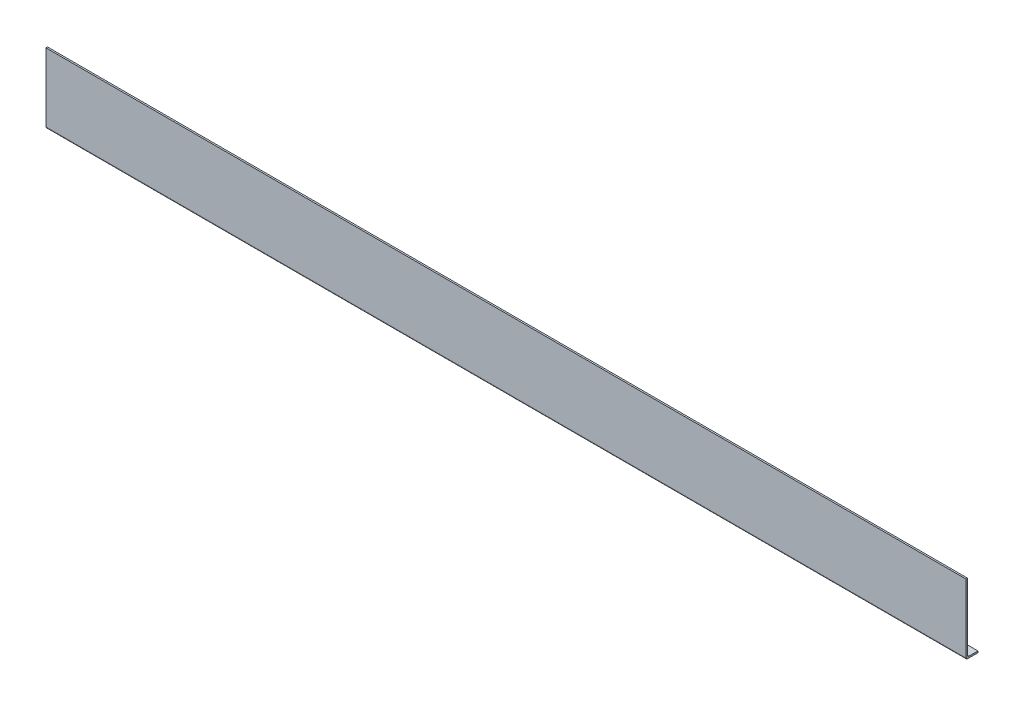
ISO-10303-21;
HEADER;
FILE_DESCRIPTION(('STEP AP214'),'2;1');
FILE_NAME('part.step','',(''),(''),'','','');
FILE_SCHEMA(('AUTOMOTIVE_DESIGN { 1 0 10303 214 1 1 1 1 }'));
ENDSEC;
DATA;
#1=APPLICATION_CONTEXT('core data for automotive mechanical design processes');
#2=APPLICATION_PROTOCOL_DEFINITION('international standard','automotive_design',2000,#1);
#3=PRODUCT_CONTEXT('',#1,'mechanical');
#4=PRODUCT('Part','Part','',(#3));
#5=PRODUCT_RELATED_PRODUCT_CATEGORY('part','',(#4));
#6=PRODUCT_DEFINITION_FORMATION('','',#4);
#7=PRODUCT_DEFINITION_CONTEXT('part definition',#1,'design');
#8=PRODUCT_DEFINITION('design','',#6,#7);
#9=PRODUCT_DEFINITION_SHAPE('','',#8);
#10=(LENGTH_UNIT() NAMED_UNIT(*) SI_UNIT(.MILLI.,.METRE.));
#11=(NAMED_UNIT(*) PLANE_ANGLE_UNIT() SI_UNIT($,.RADIAN.));
#12=(NAMED_UNIT(*) SI_UNIT($,.STERADIAN.) SOLID_ANGLE_UNIT());
#13=UNCERTAINTY_MEASURE_WITH_UNIT(LENGTH_MEASURE(1.E-05),#10,'distance_accuracy_value','');
#14=(GEOMETRIC_REPRESENTATION_CONTEXT(3) GLOBAL_UNCERTAINTY_ASSIGNED_CONTEXT((#13)) GLOBAL_UNIT_ASSIGNED_CONTEXT((#10,
#11,#12)) REPRESENTATION_CONTEXT('',''));
#15=CARTESIAN_POINT('',(0.,0.,0.));
#16=DIRECTION('',(0.,0.,1.));
#17=DIRECTION('',(1.,0.,0.));
#18=AXIS2_PLACEMENT_3D('',#15,#16,#17);
#19=CARTESIAN_POINT('',(1750.,3.,0.));
#20=DIRECTION('',(0.,0.,1.));
#21=DIRECTION('',(1.,0.,0.));
#22=AXIS2_PLACEMENT_3D('',#19,#20,#21);
#23=PLANE('',#22);
#24=DIRECTION('',(0.,1.,0.));
#25=VECTOR('',#24,1.);
#26=CARTESIAN_POINT('',(0.,3.,0.));
#27=LINE('',#26,#25);
#28=CARTESIAN_POINT('',(0.,0.,0.));
#29=VERTEX_POINT('',#28);
#30=CARTESIAN_POINT('',(0.,3.,0.));
#31=VERTEX_POINT('',#30);
#32=EDGE_CURVE('E123',#29,#31,#27,.T.);
#33=ORIENTED_EDGE('',*,*,#32,.T.);
#34=DIRECTION('',(-1.,0.,0.));
#35=VECTOR('',#34,1.);
#36=CARTESIAN_POINT('',(1750.,3.,0.));
#37=LINE('',#36,#35);
#38=CARTESIAN_POINT('',(1750.,3.,0.));
#39=VERTEX_POINT('',#38);
#40=EDGE_CURVE('E104',#39,#31,#37,.T.);
#41=ORIENTED_EDGE('',*,*,#40,.F.);
#42=DIRECTION('',(0.,1.,0.));
#43=VECTOR('',#42,1.);
#44=CARTESIAN_POINT('',(1750.,3.,0.));
#45=LINE('',#44,#43);
#46=CARTESIAN_POINT('',(1750.,0.,0.));
#47=VERTEX_POINT('',#46);
#48=EDGE_CURVE('E111',#47,#39,#45,.T.);
#49=ORIENTED_EDGE('',*,*,#48,.F.);
#50=DIRECTION('',(-1.,0.,0.));
#51=VECTOR('',#50,1.);
#52=CARTESIAN_POINT('',(1750.,0.,0.));
#53=LINE('',#52,#51);
#54=EDGE_CURVE('E162',#47,#29,#53,.T.);
#55=ORIENTED_EDGE('',*,*,#54,.T.);
#56=EDGE_LOOP('',(#33,#41,#49,#55));
#57=FACE_BOUND('',#56,.T.);
#58=ADVANCED_FACE('F33',(#57),#23,.F.);
#59=CARTESIAN_POINT('',(1750.,3.,0.));
#60=DIRECTION('',(0.,-1.,0.));
#61=DIRECTION('',(0.,0.,-1.));
#62=AXIS2_PLACEMENT_3D('',#59,#60,#61);
#63=PLANE('',#62);
#64=DIRECTION('',(0.,0.,1.));
#65=VECTOR('',#64,1.);
#66=CARTESIAN_POINT('',(0.,3.,0.));
#67=LINE('',#66,#65);
#68=CARTESIAN_POINT('',(0.,3.,17.));
#69=VERTEX_POINT('',#68);
#70=EDGE_CURVE('E143',#31,#69,#67,.T.);
#71=ORIENTED_EDGE('',*,*,#70,.T.);
#72=DIRECTION('',(-1.,0.,0.));
#73=VECTOR('',#72,1.);
#74=CARTESIAN_POINT('',(1750.,3.,17.));
#75=LINE('',#74,#73);
#76=CARTESIAN_POINT('',(1750.,3.,17.));
#77=VERTEX_POINT('',#76);
#78=EDGE_CURVE('E107',#69,#77,#75,.F.);
#79=ORIENTED_EDGE('',*,*,#78,.T.);
#80=DIRECTION('',(0.,0.,1.));
#81=VECTOR('',#80,1.);
#82=CARTESIAN_POINT('',(1750.,3.,0.));
#83=LINE('',#82,#81);
#84=EDGE_CURVE('E99',#39,#77,#83,.T.);
#85=ORIENTED_EDGE('',*,*,#84,.F.);
#86=ORIENTED_EDGE('',*,*,#40,.T.);
#87=EDGE_LOOP('',(#71,#79,#85,#86));
#88=FACE_BOUND('',#87,.T.);
#89=ADVANCED_FACE('F102',(#88),#63,.F.);
#90=CARTESIAN_POINT('',(1750.,3.,20.));
#91=DIRECTION('',(0.,0.,1.));
#92=DIRECTION('',(1.,0.,0.));
#93=AXIS2_PLACEMENT_3D('',#90,#91,#92);
#94=PLANE('',#93);
#95=DIRECTION('',(0.,1.,0.));
#96=VECTOR('',#95,1.);
#97=CARTESIAN_POINT('',(1750.,3.,20.));
#98=LINE('',#97,#96);
#99=CARTESIAN_POINT('',(1750.,6.,20.));
#100=VERTEX_POINT('',#99);
#101=CARTESIAN_POINT('',(1750.,133.,20.));
#102=VERTEX_POINT('',#101);
#103=EDGE_CURVE('E110',#100,#102,#98,.T.);
#104=ORIENTED_EDGE('',*,*,#103,.F.);
#105=DIRECTION('',(-1.,0.,0.));
#106=VECTOR('',#105,1.);
#107=CARTESIAN_POINT('',(0.,6.,20.));
#108=LINE('',#107,#106);
#109=CARTESIAN_POINT('',(0.,6.,20.));
#110=VERTEX_POINT('',#109);
#111=EDGE_CURVE('E124',#100,#110,#108,.T.);
#112=ORIENTED_EDGE('',*,*,#111,.T.);
#113=DIRECTION('',(0.,1.,0.));
#114=VECTOR('',#113,1.);
#115=CARTESIAN_POINT('',(0.,3.,20.));
#116=LINE('',#115,#114);
#117=CARTESIAN_POINT('',(0.,133.,20.));
#118=VERTEX_POINT('',#117);
#119=EDGE_CURVE('E145',#110,#118,#116,.T.);
#120=ORIENTED_EDGE('',*,*,#119,.T.);
#121=DIRECTION('',(-1.,0.,0.));
#122=VECTOR('',#121,1.);
#123=CARTESIAN_POINT('',(1750.,133.,20.));
#124=LINE('',#123,#122);
#125=EDGE_CURVE('E125',#102,#118,#124,.T.);
#126=ORIENTED_EDGE('',*,*,#125,.F.);
#127=EDGE_LOOP('',(#104,#112,#120,#126));
#128=FACE_BOUND('',#127,.T.);
#129=ADVANCED_FACE('F153',(#128),#94,.F.);
#130=CARTESIAN_POINT('',(1750.,133.,23.));
#131=DIRECTION('',(0.,-1.,0.));
#132=DIRECTION('',(0.,0.,-1.));
#133=AXIS2_PLACEMENT_3D('',#130,#131,#132);
#134=PLANE('',#133);
#135=DIRECTION('',(0.,0.,1.));
#136=VECTOR('',#135,1.);
#137=CARTESIAN_POINT('',(0.,133.,23.));
#138=LINE('',#137,#136);
#139=CARTESIAN_POINT('',(0.,133.,23.));
#140=VERTEX_POINT('',#139);
#141=EDGE_CURVE('E165',#118,#140,#138,.T.);
#142=ORIENTED_EDGE('',*,*,#141,.T.);
#143=DIRECTION('',(-1.,0.,0.));
#144=VECTOR('',#143,1.);
#145=CARTESIAN_POINT('',(1750.,133.,23.));
#146=LINE('',#145,#144);
#147=CARTESIAN_POINT('',(1750.,133.,23.));
#148=VERTEX_POINT('',#147);
#149=EDGE_CURVE('E130',#148,#140,#146,.T.);
#150=ORIENTED_EDGE('',*,*,#149,.F.);
#151=DIRECTION('',(0.,0.,1.));
#152=VECTOR('',#151,1.);
#153=CARTESIAN_POINT('',(1750.,133.,23.));
#154=LINE('',#153,#152);
#155=EDGE_CURVE('E155',#102,#148,#154,.T.);
#156=ORIENTED_EDGE('',*,*,#155,.F.);
#157=ORIENTED_EDGE('',*,*,#125,.T.);
#158=EDGE_LOOP('',(#142,#150,#156,#157));
#159=FACE_BOUND('',#158,.T.);
#160=ADVANCED_FACE('F174',(#159),#134,.F.);
#161=CARTESIAN_POINT('',(1750.,0.,23.));
#162=DIRECTION('',(0.,0.,-1.));
#163=DIRECTION('',(-1.,0.,0.));
#164=AXIS2_PLACEMENT_3D('',#161,#162,#163);
#165=PLANE('',#164);
#166=DIRECTION('',(0.,-1.,0.));
#167=VECTOR('',#166,1.);
#168=CARTESIAN_POINT('',(0.,0.,23.));
#169=LINE('',#168,#167);
#170=CARTESIAN_POINT('',(0.,3.,23.));
#171=VERTEX_POINT('',#170);
#172=EDGE_CURVE('E167',#140,#171,#169,.T.);
#173=ORIENTED_EDGE('',*,*,#172,.T.);
#174=DIRECTION('',(-1.,0.,0.));
#175=VECTOR('',#174,1.);
#176=CARTESIAN_POINT('',(1750.,3.,23.));
#177=LINE('',#176,#175);
#178=CARTESIAN_POINT('',(1750.,3.,23.));
#179=VERTEX_POINT('',#178);
#180=EDGE_CURVE('E48',#171,#179,#177,.F.);
#181=ORIENTED_EDGE('',*,*,#180,.T.);
#182=DIRECTION('',(0.,-1.,0.));
#183=VECTOR('',#182,1.);
#184=CARTESIAN_POINT('',(1750.,0.,23.));
#185=LINE('',#184,#183);
#186=EDGE_CURVE('E157',#148,#179,#185,.T.);
#187=ORIENTED_EDGE('',*,*,#186,.F.);
#188=ORIENTED_EDGE('',*,*,#149,.T.);
#189=EDGE_LOOP('',(#173,#181,#187,#188));
#190=FACE_BOUND('',#189,.T.);
#191=ADVANCED_FACE('F172',(#190),#165,.F.);
#192=CARTESIAN_POINT('',(1750.,0.,0.));
#193=DIRECTION('',(0.,1.,0.));
#194=DIRECTION('',(0.,0.,1.));
#195=AXIS2_PLACEMENT_3D('',#192,#193,#194);
#196=PLANE('',#195);
#197=DIRECTION('',(0.,0.,-1.));
#198=VECTOR('',#197,1.);
#199=CARTESIAN_POINT('',(1750.,0.,0.));
#200=LINE('',#199,#198);
#201=CARTESIAN_POINT('',(1750.,0.,20.));
#202=VERTEX_POINT('',#201);
#203=EDGE_CURVE('E116',#202,#47,#200,.T.);
#204=ORIENTED_EDGE('',*,*,#203,.F.);
#205=DIRECTION('',(-1.,0.,0.));
#206=VECTOR('',#205,1.);
#207=CARTESIAN_POINT('',(1750.,0.,20.));
#208=LINE('',#207,#206);
#209=CARTESIAN_POINT('',(0.,0.,20.));
#210=VERTEX_POINT('',#209);
#211=EDGE_CURVE('E135',#202,#210,#208,.T.);
#212=ORIENTED_EDGE('',*,*,#211,.T.);
#213=DIRECTION('',(0.,0.,-1.));
#214=VECTOR('',#213,1.);
#215=CARTESIAN_POINT('',(0.,0.,0.));
#216=LINE('',#215,#214);
#217=EDGE_CURVE('E120',#210,#29,#216,.T.);
#218=ORIENTED_EDGE('',*,*,#217,.T.);
#219=ORIENTED_EDGE('',*,*,#54,.F.);
#220=EDGE_LOOP('',(#204,#212,#218,#219));
#221=FACE_BOUND('',#220,.T.);
#222=ADVANCED_FACE('F179',(#221),#196,.F.);
#223=CARTESIAN_POINT('',(1750.,0.,0.));
#224=DIRECTION('',(-1.,0.,0.));
#225=DIRECTION('',(0.,0.,1.));
#226=AXIS2_PLACEMENT_3D('',#223,#224,#225);
#227=PLANE('',#226);
#228=ORIENTED_EDGE('',*,*,#186,.T.);
#229=CARTESIAN_POINT('',(1750.,3.,20.));
#230=DIRECTION('',(-1.,0.,0.));
#231=DIRECTION('',(0.,0.,1.));
#232=AXIS2_PLACEMENT_3D('',#229,#230,#231);
#233=CIRCLE('',#232,3.);
#234=EDGE_CURVE('E140',#179,#202,#233,.F.);
#235=ORIENTED_EDGE('',*,*,#234,.T.);
#236=ORIENTED_EDGE('',*,*,#203,.T.);
#237=ORIENTED_EDGE('',*,*,#48,.T.);
#238=ORIENTED_EDGE('',*,*,#84,.T.);
#239=CARTESIAN_POINT('',(1750.,6.,17.));
#240=DIRECTION('',(-1.,0.,0.));
#241=DIRECTION('',(0.,0.,1.));
#242=AXIS2_PLACEMENT_3D('',#239,#240,#241);
#243=CIRCLE('',#242,3.);
#244=EDGE_CURVE('E11',#77,#100,#243,.T.);
#245=ORIENTED_EDGE('',*,*,#244,.T.);
#246=ORIENTED_EDGE('',*,*,#103,.T.);
#247=ORIENTED_EDGE('',*,*,#155,.T.);
#248=EDGE_LOOP('',(#228,#235,#236,#237,#238,#245,#246,#247));
#249=FACE_BOUND('',#248,.T.);
#250=ADVANCED_FACE('F114',(#249),#227,.F.);
#251=CARTESIAN_POINT('',(0.,0.,0.));
#252=DIRECTION('',(-1.,0.,0.));
#253=DIRECTION('',(0.,0.,1.));
#254=AXIS2_PLACEMENT_3D('',#251,#252,#253);
#255=PLANE('',#254);
#256=ORIENTED_EDGE('',*,*,#217,.F.);
#257=CARTESIAN_POINT('',(0.,3.,20.));
#258=DIRECTION('',(-1.,0.,0.));
#259=DIRECTION('',(0.,0.,1.));
#260=AXIS2_PLACEMENT_3D('',#257,#258,#259);
#261=CIRCLE('',#260,3.);
#262=EDGE_CURVE('E56',#210,#171,#261,.T.);
#263=ORIENTED_EDGE('',*,*,#262,.T.);
#264=ORIENTED_EDGE('',*,*,#172,.F.);
#265=ORIENTED_EDGE('',*,*,#141,.F.);
#266=ORIENTED_EDGE('',*,*,#119,.F.);
#267=CARTESIAN_POINT('',(0.,6.,17.));
#268=DIRECTION('',(-1.,0.,0.));
#269=DIRECTION('',(0.,0.,1.));
#270=AXIS2_PLACEMENT_3D('',#267,#268,#269);
#271=CIRCLE('',#270,3.);
#272=EDGE_CURVE('E41',#110,#69,#271,.F.);
#273=ORIENTED_EDGE('',*,*,#272,.T.);
#274=ORIENTED_EDGE('',*,*,#70,.F.);
#275=ORIENTED_EDGE('',*,*,#32,.F.);
#276=EDGE_LOOP('',(#256,#263,#264,#265,#266,#273,#274,#275));
#277=FACE_BOUND('',#276,.T.);
#278=ADVANCED_FACE('F142',(#277),#255,.T.);
#279=CARTESIAN_POINT('',(1750.,6.,17.));
#280=DIRECTION('',(1.,0.,0.));
#281=DIRECTION('',(0.,0.,-1.));
#282=AXIS2_PLACEMENT_3D('',#279,#280,#281);
#283=CYLINDRICAL_SURFACE('',#282,3.);
#284=ORIENTED_EDGE('',*,*,#244,.F.);
#285=ORIENTED_EDGE('',*,*,#78,.F.);
#286=ORIENTED_EDGE('',*,*,#272,.F.);
#287=ORIENTED_EDGE('',*,*,#111,.F.);
#288=EDGE_LOOP('',(#284,#285,#286,#287));
#289=FACE_BOUND('',#288,.T.);
#290=ADVANCED_FACE('F149',(#289),#283,.F.);
#291=CARTESIAN_POINT('',(1750.,3.,20.));
#292=DIRECTION('',(-1.,0.,0.));
#293=DIRECTION('',(0.,0.,1.));
#294=AXIS2_PLACEMENT_3D('',#291,#292,#293);
#295=CYLINDRICAL_SURFACE('',#294,3.);
#296=ORIENTED_EDGE('',*,*,#234,.F.);
#297=ORIENTED_EDGE('',*,*,#180,.F.);
#298=ORIENTED_EDGE('',*,*,#262,.F.);
#299=ORIENTED_EDGE('',*,*,#211,.F.);
#300=EDGE_LOOP('',(#296,#297,#298,#299));
#301=FACE_BOUND('',#300,.T.);
#302=ADVANCED_FACE('F35',(#301),#295,.T.);
#303=CLOSED_SHELL('',(#58,#89,#129,#160,#191,#222,#250,#278,#290,#302));
#304=MANIFOLD_SOLID_BREP('B2',#303);
#305=ADVANCED_BREP_SHAPE_REPRESENTATION('',(#18,#304),#14);
#306=SHAPE_DEFINITION_REPRESENTATION(#9,#305);
ENDSEC;
END-ISO-10303-21;
